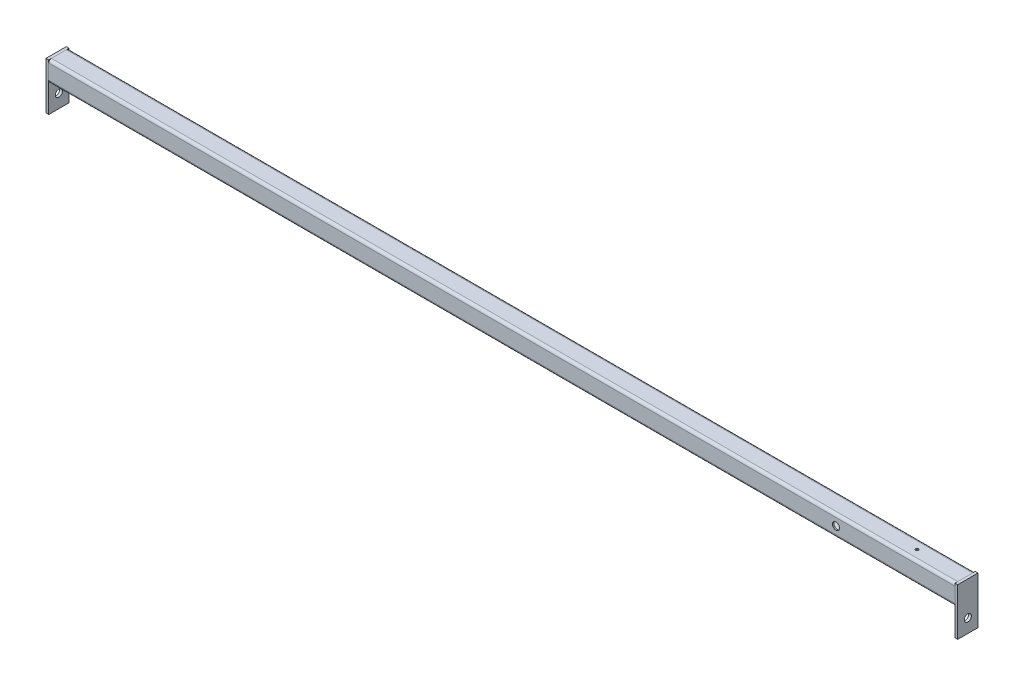
ISO-10303-21;
HEADER;
FILE_DESCRIPTION(('STEP AP214'),'2;1');
FILE_NAME('part.step','',(''),(''),'','','');
FILE_SCHEMA(('AUTOMOTIVE_DESIGN { 1 0 10303 214 1 1 1 1 }'));
ENDSEC;
DATA;
#1=APPLICATION_CONTEXT('core data for automotive mechanical design processes');
#2=APPLICATION_PROTOCOL_DEFINITION('international standard','automotive_design',2000,#1);
#3=PRODUCT_CONTEXT('',#1,'mechanical');
#4=PRODUCT('Part','Part','',(#3));
#5=PRODUCT_RELATED_PRODUCT_CATEGORY('part','',(#4));
#6=PRODUCT_DEFINITION_FORMATION('','',#4);
#7=PRODUCT_DEFINITION_CONTEXT('part definition',#1,'design');
#8=PRODUCT_DEFINITION('design','',#6,#7);
#9=PRODUCT_DEFINITION_SHAPE('','',#8);
#10=(LENGTH_UNIT() NAMED_UNIT(*) SI_UNIT(.MILLI.,.METRE.));
#11=(NAMED_UNIT(*) PLANE_ANGLE_UNIT() SI_UNIT($,.RADIAN.));
#12=(NAMED_UNIT(*) SI_UNIT($,.STERADIAN.) SOLID_ANGLE_UNIT());
#13=UNCERTAINTY_MEASURE_WITH_UNIT(LENGTH_MEASURE(1.E-05),#10,'distance_accuracy_value','');
#14=(GEOMETRIC_REPRESENTATION_CONTEXT(3) GLOBAL_UNCERTAINTY_ASSIGNED_CONTEXT((#13)) GLOBAL_UNIT_ASSIGNED_CONTEXT((#10,
#11,#12)) REPRESENTATION_CONTEXT('',''));
#15=CARTESIAN_POINT('',(0.,0.,0.));
#16=DIRECTION('',(0.,0.,1.));
#17=DIRECTION('',(1.,0.,0.));
#18=AXIS2_PLACEMENT_3D('',#15,#16,#17);
#19=CARTESIAN_POINT('',(1344.,66.,11.0000000000001));
#20=DIRECTION('',(-1.,0.,0.));
#21=DIRECTION('',(0.,0.,1.));
#22=AXIS2_PLACEMENT_3D('',#19,#20,#21);
#23=CYLINDRICAL_SURFACE('',#22,2.);
#24=CARTESIAN_POINT('',(2.,66.,11.));
#25=DIRECTION('',(1.,0.,0.));
#26=DIRECTION('',(0.,0.,-1.));
#27=AXIS2_PLACEMENT_3D('',#24,#25,#26);
#28=CIRCLE('',#27,2.);
#29=CARTESIAN_POINT('',(2.00000000000045,68.,11.));
#30=VERTEX_POINT('',#29);
#31=CARTESIAN_POINT('',(2.,66.,13.));
#32=VERTEX_POINT('',#31);
#33=EDGE_CURVE('E14',#30,#32,#28,.T.);
#34=ORIENTED_EDGE('',*,*,#33,.F.);
#35=DIRECTION('',(-1.,0.,0.));
#36=VECTOR('',#35,1.);
#37=CARTESIAN_POINT('',(1344.,68.,11.0000000000001));
#38=LINE('',#37,#36);
#39=CARTESIAN_POINT('',(1342.,68.,11.0000000000005));
#40=VERTEX_POINT('',#39);
#41=EDGE_CURVE('E235',#40,#30,#38,.T.);
#42=ORIENTED_EDGE('',*,*,#41,.F.);
#43=CARTESIAN_POINT('',(1342.,66.,11.0000000000001));
#44=DIRECTION('',(-1.,0.,0.));
#45=DIRECTION('',(0.,0.,1.));
#46=AXIS2_PLACEMENT_3D('',#43,#44,#45);
#47=CIRCLE('',#46,2.);
#48=CARTESIAN_POINT('',(1342.,66.,13.0000000000001));
#49=VERTEX_POINT('',#48);
#50=EDGE_CURVE('E216',#49,#40,#47,.T.);
#51=ORIENTED_EDGE('',*,*,#50,.F.);
#52=DIRECTION('',(-1.,0.,0.));
#53=VECTOR('',#52,1.);
#54=CARTESIAN_POINT('',(1344.,66.,13.0000000000001));
#55=LINE('',#54,#53);
#56=EDGE_CURVE('E256',#49,#32,#55,.T.);
#57=ORIENTED_EDGE('',*,*,#56,.T.);
#58=EDGE_LOOP('',(#34,#42,#51,#57));
#59=FACE_BOUND('',#58,.T.);
#60=ADVANCED_FACE('F88',(#59),#23,.F.);
#61=CARTESIAN_POINT('',(1344.,68.,-10.9999999999999));
#62=DIRECTION('',(0.,-1.,0.));
#63=DIRECTION('',(0.,0.,-1.));
#64=AXIS2_PLACEMENT_3D('',#61,#62,#63);
#65=PLANE('',#64);
#66=CARTESIAN_POINT('',(1271.,68.,0.));
#67=DIRECTION('',(0.,-1.,0.));
#68=DIRECTION('',(0.,0.,-1.));
#69=AXIS2_PLACEMENT_3D('',#66,#67,#68);
#70=CIRCLE('',#69,2.09999999999999);
#71=CARTESIAN_POINT('',(1271.,68.,-2.09999999999999));
#72=VERTEX_POINT('',#71);
#73=EDGE_CURVE('E338',#72,#72,#70,.T.);
#74=ORIENTED_EDGE('',*,*,#73,.F.);
#75=EDGE_LOOP('',(#74));
#76=FACE_BOUND('',#75,.T.);
#77=DIRECTION('',(0.,0.,1.));
#78=VECTOR('',#77,1.);
#79=CARTESIAN_POINT('',(2.,68.,-10.9999999999999));
#80=LINE('',#79,#78);
#81=CARTESIAN_POINT('',(2.,68.,-11.0000000000024));
#82=VERTEX_POINT('',#81);
#83=EDGE_CURVE('E311',#82,#30,#80,.T.);
#84=ORIENTED_EDGE('',*,*,#83,.F.);
#85=DIRECTION('',(-1.,0.,0.));
#86=VECTOR('',#85,1.);
#87=CARTESIAN_POINT('',(1344.,68.,-10.9999999999999));
#88=LINE('',#87,#86);
#89=CARTESIAN_POINT('',(1342.,68.,-11.0000000000009));
#90=VERTEX_POINT('',#89);
#91=EDGE_CURVE('E238',#90,#82,#88,.T.);
#92=ORIENTED_EDGE('',*,*,#91,.F.);
#93=DIRECTION('',(0.,0.,-1.));
#94=VECTOR('',#93,1.);
#95=CARTESIAN_POINT('',(1342.,68.,-10.9999999999999));
#96=LINE('',#95,#94);
#97=EDGE_CURVE('E273',#40,#90,#96,.T.);
#98=ORIENTED_EDGE('',*,*,#97,.F.);
#99=ORIENTED_EDGE('',*,*,#41,.T.);
#100=EDGE_LOOP('',(#84,#92,#98,#99));
#101=FACE_BOUND('',#100,.T.);
#102=ADVANCED_FACE('F386',(#76,#101),#65,.T.);
#103=CARTESIAN_POINT('',(1344.,66.,-10.9999999999999));
#104=DIRECTION('',(-1.,0.,0.));
#105=DIRECTION('',(0.,0.,1.));
#106=AXIS2_PLACEMENT_3D('',#103,#104,#105);
#107=CYLINDRICAL_SURFACE('',#106,2.);
#108=CARTESIAN_POINT('',(2.,66.,-11.));
#109=DIRECTION('',(1.,0.,0.));
#110=DIRECTION('',(0.,0.,-1.));
#111=AXIS2_PLACEMENT_3D('',#108,#109,#110);
#112=CIRCLE('',#111,2.);
#113=CARTESIAN_POINT('',(2.,66.,-13.));
#114=VERTEX_POINT('',#113);
#115=EDGE_CURVE('E135',#114,#82,#112,.T.);
#116=ORIENTED_EDGE('',*,*,#115,.F.);
#117=DIRECTION('',(-1.,0.,0.));
#118=VECTOR('',#117,1.);
#119=CARTESIAN_POINT('',(1344.,66.,-12.9999999999999));
#120=LINE('',#119,#118);
#121=CARTESIAN_POINT('',(1342.,66.,-12.9999999999999));
#122=VERTEX_POINT('',#121);
#123=EDGE_CURVE('E241',#122,#114,#120,.T.);
#124=ORIENTED_EDGE('',*,*,#123,.F.);
#125=CARTESIAN_POINT('',(1342.,66.,-10.9999999999999));
#126=DIRECTION('',(-1.,0.,0.));
#127=DIRECTION('',(0.,0.,1.));
#128=AXIS2_PLACEMENT_3D('',#125,#126,#127);
#129=CIRCLE('',#128,2.);
#130=EDGE_CURVE('E275',#90,#122,#129,.T.);
#131=ORIENTED_EDGE('',*,*,#130,.F.);
#132=ORIENTED_EDGE('',*,*,#91,.T.);
#133=EDGE_LOOP('',(#116,#124,#131,#132));
#134=FACE_BOUND('',#133,.T.);
#135=ADVANCED_FACE('F391',(#134),#107,.F.);
#136=CARTESIAN_POINT('',(1344.,66.,-12.9999999999999));
#137=DIRECTION('',(0.,0.,1.));
#138=DIRECTION('',(1.,0.,0.));
#139=AXIS2_PLACEMENT_3D('',#136,#137,#138);
#140=PLANE('',#139);
#141=CARTESIAN_POINT('',(1166.,55.,-12.9999999999999));
#142=DIRECTION('',(0.,0.,1.));
#143=DIRECTION('',(1.,0.,0.));
#144=AXIS2_PLACEMENT_3D('',#141,#142,#143);
#145=CIRCLE('',#144,5.24999999999998);
#146=CARTESIAN_POINT('',(1171.25,55.,-12.9999999999999));
#147=VERTEX_POINT('',#146);
#148=EDGE_CURVE('E329',#147,#147,#145,.T.);
#149=ORIENTED_EDGE('',*,*,#148,.F.);
#150=EDGE_LOOP('',(#149));
#151=FACE_BOUND('',#150,.T.);
#152=DIRECTION('',(0.,1.,0.));
#153=VECTOR('',#152,1.);
#154=CARTESIAN_POINT('',(2.,66.,-13.));
#155=LINE('',#154,#153);
#156=CARTESIAN_POINT('',(2.,44.,-13.));
#157=VERTEX_POINT('',#156);
#158=EDGE_CURVE('E308',#157,#114,#155,.T.);
#159=ORIENTED_EDGE('',*,*,#158,.F.);
#160=DIRECTION('',(-1.,0.,0.));
#161=VECTOR('',#160,1.);
#162=CARTESIAN_POINT('',(1344.,44.,-12.9999999999999));
#163=LINE('',#162,#161);
#164=CARTESIAN_POINT('',(1342.,44.,-12.9999999999999));
#165=VERTEX_POINT('',#164);
#166=EDGE_CURVE('E244',#165,#157,#163,.T.);
#167=ORIENTED_EDGE('',*,*,#166,.F.);
#168=DIRECTION('',(0.,-1.,0.));
#169=VECTOR('',#168,1.);
#170=CARTESIAN_POINT('',(1342.,66.,-12.9999999999999));
#171=LINE('',#170,#169);
#172=EDGE_CURVE('E277',#122,#165,#171,.T.);
#173=ORIENTED_EDGE('',*,*,#172,.F.);
#174=ORIENTED_EDGE('',*,*,#123,.T.);
#175=EDGE_LOOP('',(#159,#167,#173,#174));
#176=FACE_BOUND('',#175,.T.);
#177=ADVANCED_FACE('F418',(#151,#176),#140,.T.);
#178=CARTESIAN_POINT('',(1344.,44.,-10.9999999999999));
#179=DIRECTION('',(-1.,0.,0.));
#180=DIRECTION('',(0.,0.,1.));
#181=AXIS2_PLACEMENT_3D('',#178,#179,#180);
#182=CYLINDRICAL_SURFACE('',#181,2.);
#183=CARTESIAN_POINT('',(2.,44.,-11.));
#184=DIRECTION('',(1.,0.,0.));
#185=DIRECTION('',(0.,0.,-1.));
#186=AXIS2_PLACEMENT_3D('',#183,#184,#185);
#187=CIRCLE('',#186,2.);
#188=CARTESIAN_POINT('',(2.,42.,-11.0000000000011));
#189=VERTEX_POINT('',#188);
#190=EDGE_CURVE('E306',#189,#157,#187,.T.);
#191=ORIENTED_EDGE('',*,*,#190,.F.);
#192=DIRECTION('',(-1.,0.,0.));
#193=VECTOR('',#192,1.);
#194=CARTESIAN_POINT('',(1344.,42.,-10.9999999999999));
#195=LINE('',#194,#193);
#196=CARTESIAN_POINT('',(1342.,42.,-11.0000000000024));
#197=VERTEX_POINT('',#196);
#198=EDGE_CURVE('E247',#197,#189,#195,.T.);
#199=ORIENTED_EDGE('',*,*,#198,.F.);
#200=CARTESIAN_POINT('',(1342.,44.,-10.9999999999999));
#201=DIRECTION('',(-1.,0.,0.));
#202=DIRECTION('',(0.,0.,1.));
#203=AXIS2_PLACEMENT_3D('',#200,#201,#202);
#204=CIRCLE('',#203,2.);
#205=EDGE_CURVE('E279',#165,#197,#204,.T.);
#206=ORIENTED_EDGE('',*,*,#205,.F.);
#207=ORIENTED_EDGE('',*,*,#166,.T.);
#208=EDGE_LOOP('',(#191,#199,#206,#207));
#209=FACE_BOUND('',#208,.T.);
#210=ADVANCED_FACE('F414',(#209),#182,.F.);
#211=CARTESIAN_POINT('',(1344.,42.,11.0000000000001));
#212=DIRECTION('',(0.,1.,0.));
#213=DIRECTION('',(0.,0.,1.));
#214=AXIS2_PLACEMENT_3D('',#211,#212,#213);
#215=PLANE('',#214);
#216=CARTESIAN_POINT('',(1271.,42.,0.));
#217=DIRECTION('',(0.,1.,0.));
#218=DIRECTION('',(0.,0.,1.));
#219=AXIS2_PLACEMENT_3D('',#216,#217,#218);
#220=CIRCLE('',#219,2.09999999999999);
#221=CARTESIAN_POINT('',(1271.,42.,2.09999999999999));
#222=VERTEX_POINT('',#221);
#223=EDGE_CURVE('E341',#222,#222,#220,.T.);
#224=ORIENTED_EDGE('',*,*,#223,.F.);
#225=EDGE_LOOP('',(#224));
#226=FACE_BOUND('',#225,.T.);
#227=DIRECTION('',(0.,0.,-1.));
#228=VECTOR('',#227,1.);
#229=CARTESIAN_POINT('',(2.,42.,11.0000000000001));
#230=LINE('',#229,#228);
#231=CARTESIAN_POINT('',(2.,42.,11.0000000000001));
#232=VERTEX_POINT('',#231);
#233=EDGE_CURVE('E304',#232,#189,#230,.T.);
#234=ORIENTED_EDGE('',*,*,#233,.F.);
#235=DIRECTION('',(-1.,0.,0.));
#236=VECTOR('',#235,1.);
#237=CARTESIAN_POINT('',(1344.,42.,11.0000000000001));
#238=LINE('',#237,#236);
#239=CARTESIAN_POINT('',(1342.,42.,10.9999999999991));
#240=VERTEX_POINT('',#239);
#241=EDGE_CURVE('E250',#240,#232,#238,.T.);
#242=ORIENTED_EDGE('',*,*,#241,.F.);
#243=DIRECTION('',(0.,0.,1.));
#244=VECTOR('',#243,1.);
#245=CARTESIAN_POINT('',(1342.,42.,11.0000000000001));
#246=LINE('',#245,#244);
#247=EDGE_CURVE('E229',#197,#240,#246,.T.);
#248=ORIENTED_EDGE('',*,*,#247,.F.);
#249=ORIENTED_EDGE('',*,*,#198,.T.);
#250=EDGE_LOOP('',(#234,#242,#248,#249));
#251=FACE_BOUND('',#250,.T.);
#252=ADVANCED_FACE('F409',(#226,#251),#215,.T.);
#253=CARTESIAN_POINT('',(1344.,44.,11.0000000000001));
#254=DIRECTION('',(-1.,0.,0.));
#255=DIRECTION('',(0.,0.,1.));
#256=AXIS2_PLACEMENT_3D('',#253,#254,#255);
#257=CYLINDRICAL_SURFACE('',#256,2.);
#258=CARTESIAN_POINT('',(2.,44.,11.));
#259=DIRECTION('',(1.,0.,0.));
#260=DIRECTION('',(0.,0.,-1.));
#261=AXIS2_PLACEMENT_3D('',#258,#259,#260);
#262=CIRCLE('',#261,2.);
#263=CARTESIAN_POINT('',(2.,44.,13.));
#264=VERTEX_POINT('',#263);
#265=EDGE_CURVE('E302',#264,#232,#262,.T.);
#266=ORIENTED_EDGE('',*,*,#265,.F.);
#267=DIRECTION('',(-1.,0.,0.));
#268=VECTOR('',#267,1.);
#269=CARTESIAN_POINT('',(1344.,44.,13.0000000000001));
#270=LINE('',#269,#268);
#271=CARTESIAN_POINT('',(1342.,44.,13.0000000000001));
#272=VERTEX_POINT('',#271);
#273=EDGE_CURVE('E253',#272,#264,#270,.T.);
#274=ORIENTED_EDGE('',*,*,#273,.F.);
#275=CARTESIAN_POINT('',(1342.,44.,11.0000000000001));
#276=DIRECTION('',(-1.,0.,0.));
#277=DIRECTION('',(0.,0.,1.));
#278=AXIS2_PLACEMENT_3D('',#275,#276,#277);
#279=CIRCLE('',#278,2.);
#280=EDGE_CURVE('E227',#240,#272,#279,.T.);
#281=ORIENTED_EDGE('',*,*,#280,.F.);
#282=ORIENTED_EDGE('',*,*,#241,.T.);
#283=EDGE_LOOP('',(#266,#274,#281,#282));
#284=FACE_BOUND('',#283,.T.);
#285=ADVANCED_FACE('F404',(#284),#257,.F.);
#286=CARTESIAN_POINT('',(1344.,44.,13.0000000000001));
#287=DIRECTION('',(0.,0.,-1.));
#288=DIRECTION('',(-1.,0.,0.));
#289=AXIS2_PLACEMENT_3D('',#286,#287,#288);
#290=PLANE('',#289);
#291=CARTESIAN_POINT('',(1166.,55.,13.0000000000001));
#292=DIRECTION('',(0.,0.,-1.));
#293=DIRECTION('',(-1.,0.,0.));
#294=AXIS2_PLACEMENT_3D('',#291,#292,#293);
#295=CIRCLE('',#294,5.24999999999998);
#296=CARTESIAN_POINT('',(1160.75,55.,13.0000000000001));
#297=VERTEX_POINT('',#296);
#298=EDGE_CURVE('E258',#297,#297,#295,.T.);
#299=ORIENTED_EDGE('',*,*,#298,.F.);
#300=EDGE_LOOP('',(#299));
#301=FACE_BOUND('',#300,.T.);
#302=DIRECTION('',(0.,-1.,0.));
#303=VECTOR('',#302,1.);
#304=CARTESIAN_POINT('',(2.,44.,13.));
#305=LINE('',#304,#303);
#306=EDGE_CURVE('E299',#32,#264,#305,.T.);
#307=ORIENTED_EDGE('',*,*,#306,.F.);
#308=ORIENTED_EDGE('',*,*,#56,.F.);
#309=DIRECTION('',(0.,1.,0.));
#310=VECTOR('',#309,1.);
#311=CARTESIAN_POINT('',(1342.,44.,13.0000000000001));
#312=LINE('',#311,#310);
#313=EDGE_CURVE('E282',#272,#49,#312,.T.);
#314=ORIENTED_EDGE('',*,*,#313,.F.);
#315=ORIENTED_EDGE('',*,*,#273,.T.);
#316=EDGE_LOOP('',(#307,#308,#314,#315));
#317=FACE_BOUND('',#316,.T.);
#318=ADVANCED_FACE('F381',(#301,#317),#290,.T.);
#319=CARTESIAN_POINT('',(1342.,35.,0.));
#320=DIRECTION('',(-1.,0.,0.));
#321=DIRECTION('',(0.,0.,1.));
#322=AXIS2_PLACEMENT_3D('',#319,#320,#321);
#323=PLANE('',#322);
#324=ORIENTED_EDGE('',*,*,#50,.T.);
#325=ORIENTED_EDGE('',*,*,#97,.T.);
#326=ORIENTED_EDGE('',*,*,#130,.T.);
#327=ORIENTED_EDGE('',*,*,#172,.T.);
#328=ORIENTED_EDGE('',*,*,#205,.T.);
#329=ORIENTED_EDGE('',*,*,#247,.T.);
#330=ORIENTED_EDGE('',*,*,#280,.T.);
#331=ORIENTED_EDGE('',*,*,#313,.T.);
#332=EDGE_LOOP('',(#324,#325,#326,#327,#328,#329,#330,#331));
#333=FACE_BOUND('',#332,.T.);
#334=DIRECTION('',(0.,0.,-1.));
#335=VECTOR('',#334,1.);
#336=CARTESIAN_POINT('',(1342.,70.,-10.9999999999999));
#337=LINE('',#336,#335);
#338=CARTESIAN_POINT('',(1342.,70.,10.9999999999991));
#339=VERTEX_POINT('',#338);
#340=CARTESIAN_POINT('',(1342.,70.,-11.0000000000024));
#341=VERTEX_POINT('',#340);
#342=EDGE_CURVE('E286',#339,#341,#337,.T.);
#343=ORIENTED_EDGE('',*,*,#342,.F.);
#344=CARTESIAN_POINT('',(1342.,66.,11.0000000000001));
#345=DIRECTION('',(-1.,0.,0.));
#346=DIRECTION('',(0.,0.,1.));
#347=AXIS2_PLACEMENT_3D('',#344,#345,#346);
#348=CIRCLE('',#347,4.);
#349=CARTESIAN_POINT('',(1342.,66.,15.0000000000001));
#350=VERTEX_POINT('',#349);
#351=EDGE_CURVE('E289',#350,#339,#348,.T.);
#352=ORIENTED_EDGE('',*,*,#351,.F.);
#353=DIRECTION('',(0.,1.,0.));
#354=VECTOR('',#353,1.);
#355=CARTESIAN_POINT('',(1342.,44.,15.0000000000001));
#356=LINE('',#355,#354);
#357=CARTESIAN_POINT('',(1342.,44.,15.0000000000001));
#358=VERTEX_POINT('',#357);
#359=EDGE_CURVE('E292',#358,#350,#356,.T.);
#360=ORIENTED_EDGE('',*,*,#359,.F.);
#361=CARTESIAN_POINT('',(1342.,44.,11.0000000000001));
#362=DIRECTION('',(-1.,0.,0.));
#363=DIRECTION('',(0.,0.,1.));
#364=AXIS2_PLACEMENT_3D('',#361,#362,#363);
#365=CIRCLE('',#364,4.);
#366=CARTESIAN_POINT('',(1342.,40.,11.0000000000005));
#367=VERTEX_POINT('',#366);
#368=EDGE_CURVE('E295',#367,#358,#365,.T.);
#369=ORIENTED_EDGE('',*,*,#368,.F.);
#370=DIRECTION('',(0.,0.,1.));
#371=VECTOR('',#370,1.);
#372=CARTESIAN_POINT('',(1342.,40.,11.0000000000001));
#373=LINE('',#372,#371);
#374=CARTESIAN_POINT('',(1342.,40.,-11.0000000000009));
#375=VERTEX_POINT('',#374);
#376=EDGE_CURVE('E213',#375,#367,#373,.T.);
#377=ORIENTED_EDGE('',*,*,#376,.F.);
#378=CARTESIAN_POINT('',(1342.,44.,-10.9999999999999));
#379=DIRECTION('',(-1.,0.,0.));
#380=DIRECTION('',(0.,0.,1.));
#381=AXIS2_PLACEMENT_3D('',#378,#379,#380);
#382=CIRCLE('',#381,4.);
#383=CARTESIAN_POINT('',(1342.,44.,-14.9999999999999));
#384=VERTEX_POINT('',#383);
#385=EDGE_CURVE('E206',#384,#375,#382,.T.);
#386=ORIENTED_EDGE('',*,*,#385,.F.);
#387=DIRECTION('',(0.,-1.,0.));
#388=VECTOR('',#387,1.);
#389=CARTESIAN_POINT('',(1342.,66.,-14.9999999999999));
#390=LINE('',#389,#388);
#391=CARTESIAN_POINT('',(1342.,66.,-14.9999999999999));
#392=VERTEX_POINT('',#391);
#393=EDGE_CURVE('E210',#392,#384,#390,.T.);
#394=ORIENTED_EDGE('',*,*,#393,.F.);
#395=CARTESIAN_POINT('',(1342.,66.,-10.9999999999999));
#396=DIRECTION('',(-1.,0.,0.));
#397=DIRECTION('',(0.,0.,1.));
#398=AXIS2_PLACEMENT_3D('',#395,#396,#397);
#399=CIRCLE('',#398,4.);
#400=EDGE_CURVE('E284',#341,#392,#399,.T.);
#401=ORIENTED_EDGE('',*,*,#400,.F.);
#402=EDGE_LOOP('',(#343,#352,#360,#369,#377,#386,#394,#401));
#403=FACE_BOUND('',#402,.T.);
#404=ADVANCED_FACE('F208',(#333,#403),#323,.F.);
#405=CARTESIAN_POINT('',(1344.,66.,-10.9999999999999));
#406=DIRECTION('',(-1.,0.,0.));
#407=DIRECTION('',(0.,0.,1.));
#408=AXIS2_PLACEMENT_3D('',#405,#406,#407);
#409=CYLINDRICAL_SURFACE('',#408,4.);
#410=DIRECTION('',(-1.,0.,0.));
#411=VECTOR('',#410,1.);
#412=CARTESIAN_POINT('',(1344.,66.,-14.9999999999999));
#413=LINE('',#412,#411);
#414=CARTESIAN_POINT('',(2.,66.,-15.));
#415=VERTEX_POINT('',#414);
#416=EDGE_CURVE('E222',#392,#415,#413,.T.);
#417=ORIENTED_EDGE('',*,*,#416,.T.);
#418=CARTESIAN_POINT('',(2.,66.,-11.));
#419=DIRECTION('',(1.,0.,0.));
#420=DIRECTION('',(0.,0.,-1.));
#421=AXIS2_PLACEMENT_3D('',#418,#419,#420);
#422=CIRCLE('',#421,4.);
#423=CARTESIAN_POINT('',(2.00000000000045,70.,-11.));
#424=VERTEX_POINT('',#423);
#425=EDGE_CURVE('E91',#415,#424,#422,.T.);
#426=ORIENTED_EDGE('',*,*,#425,.T.);
#427=DIRECTION('',(-1.,0.,0.));
#428=VECTOR('',#427,1.);
#429=CARTESIAN_POINT('',(1344.,70.,-10.9999999999999));
#430=LINE('',#429,#428);
#431=EDGE_CURVE('E228',#341,#424,#430,.T.);
#432=ORIENTED_EDGE('',*,*,#431,.F.);
#433=ORIENTED_EDGE('',*,*,#400,.T.);
#434=EDGE_LOOP('',(#417,#426,#432,#433));
#435=FACE_BOUND('',#434,.T.);
#436=ADVANCED_FACE('F372',(#435),#409,.T.);
#437=CARTESIAN_POINT('',(1344.,70.,-10.9999999999999));
#438=DIRECTION('',(0.,-1.,0.));
#439=DIRECTION('',(0.,0.,-1.));
#440=AXIS2_PLACEMENT_3D('',#437,#438,#439);
#441=PLANE('',#440);
#442=CARTESIAN_POINT('',(1271.,70.,0.));
#443=DIRECTION('',(0.,-1.,0.));
#444=DIRECTION('',(0.,0.,-1.));
#445=AXIS2_PLACEMENT_3D('',#442,#443,#444);
#446=CIRCLE('',#445,2.09999999999999);
#447=CARTESIAN_POINT('',(1271.,70.,-2.09999999999999));
#448=VERTEX_POINT('',#447);
#449=EDGE_CURVE('E344',#448,#448,#446,.T.);
#450=ORIENTED_EDGE('',*,*,#449,.T.);
#451=EDGE_LOOP('',(#450));
#452=FACE_BOUND('',#451,.T.);
#453=ORIENTED_EDGE('',*,*,#431,.T.);
#454=DIRECTION('',(0.,0.,1.));
#455=VECTOR('',#454,1.);
#456=CARTESIAN_POINT('',(2.,70.,-10.9999999999999));
#457=LINE('',#456,#455);
#458=CARTESIAN_POINT('',(2.,70.,11.0000000000001));
#459=VERTEX_POINT('',#458);
#460=EDGE_CURVE('E301',#424,#459,#457,.T.);
#461=ORIENTED_EDGE('',*,*,#460,.T.);
#462=DIRECTION('',(-1.,0.,0.));
#463=VECTOR('',#462,1.);
#464=CARTESIAN_POINT('',(1344.,70.,11.0000000000001));
#465=LINE('',#464,#463);
#466=EDGE_CURVE('E232',#339,#459,#465,.T.);
#467=ORIENTED_EDGE('',*,*,#466,.F.);
#468=ORIENTED_EDGE('',*,*,#342,.T.);
#469=EDGE_LOOP('',(#453,#461,#467,#468));
#470=FACE_BOUND('',#469,.T.);
#471=ADVANCED_FACE('F369',(#452,#470),#441,.F.);
#472=CARTESIAN_POINT('',(1344.,66.,11.0000000000001));
#473=DIRECTION('',(-1.,0.,0.));
#474=DIRECTION('',(0.,0.,1.));
#475=AXIS2_PLACEMENT_3D('',#472,#473,#474);
#476=CYLINDRICAL_SURFACE('',#475,4.);
#477=ORIENTED_EDGE('',*,*,#466,.T.);
#478=CARTESIAN_POINT('',(2.,66.,11.));
#479=DIRECTION('',(1.,0.,0.));
#480=DIRECTION('',(0.,0.,-1.));
#481=AXIS2_PLACEMENT_3D('',#478,#479,#480);
#482=CIRCLE('',#481,4.);
#483=CARTESIAN_POINT('',(2.,66.,15.));
#484=VERTEX_POINT('',#483);
#485=EDGE_CURVE('E122',#459,#484,#482,.T.);
#486=ORIENTED_EDGE('',*,*,#485,.T.);
#487=DIRECTION('',(-1.,0.,0.));
#488=VECTOR('',#487,1.);
#489=CARTESIAN_POINT('',(1344.,66.,15.0000000000001));
#490=LINE('',#489,#488);
#491=EDGE_CURVE('E261',#350,#484,#490,.T.);
#492=ORIENTED_EDGE('',*,*,#491,.F.);
#493=ORIENTED_EDGE('',*,*,#351,.T.);
#494=EDGE_LOOP('',(#477,#486,#492,#493));
#495=FACE_BOUND('',#494,.T.);
#496=ADVANCED_FACE('F366',(#495),#476,.T.);
#497=CARTESIAN_POINT('',(1344.,44.,15.0000000000001));
#498=DIRECTION('',(0.,0.,-1.));
#499=DIRECTION('',(-1.,0.,0.));
#500=AXIS2_PLACEMENT_3D('',#497,#498,#499);
#501=PLANE('',#500);
#502=CARTESIAN_POINT('',(1166.,55.,15.));
#503=DIRECTION('',(0.,0.,1.));
#504=DIRECTION('',(1.,0.,0.));
#505=AXIS2_PLACEMENT_3D('',#502,#503,#504);
#506=CIRCLE('',#505,5.24999999999998);
#507=CARTESIAN_POINT('',(1171.25,55.,15.));
#508=VERTEX_POINT('',#507);
#509=EDGE_CURVE('E335',#508,#508,#506,.T.);
#510=ORIENTED_EDGE('',*,*,#509,.F.);
#511=EDGE_LOOP('',(#510));
#512=FACE_BOUND('',#511,.T.);
#513=ORIENTED_EDGE('',*,*,#491,.T.);
#514=DIRECTION('',(0.,-1.,0.));
#515=VECTOR('',#514,1.);
#516=CARTESIAN_POINT('',(2.,44.,15.));
#517=LINE('',#516,#515);
#518=CARTESIAN_POINT('',(2.,44.,15.));
#519=VERTEX_POINT('',#518);
#520=EDGE_CURVE('E321',#484,#519,#517,.T.);
#521=ORIENTED_EDGE('',*,*,#520,.T.);
#522=DIRECTION('',(-1.,0.,0.));
#523=VECTOR('',#522,1.);
#524=CARTESIAN_POINT('',(1344.,44.,15.0000000000001));
#525=LINE('',#524,#523);
#526=EDGE_CURVE('E264',#358,#519,#525,.T.);
#527=ORIENTED_EDGE('',*,*,#526,.F.);
#528=ORIENTED_EDGE('',*,*,#359,.T.);
#529=EDGE_LOOP('',(#513,#521,#527,#528));
#530=FACE_BOUND('',#529,.T.);
#531=ADVANCED_FACE('F364',(#512,#530),#501,.F.);
#532=CARTESIAN_POINT('',(1344.,44.,11.0000000000001));
#533=DIRECTION('',(-1.,0.,0.));
#534=DIRECTION('',(0.,0.,1.));
#535=AXIS2_PLACEMENT_3D('',#532,#533,#534);
#536=CYLINDRICAL_SURFACE('',#535,4.);
#537=ORIENTED_EDGE('',*,*,#526,.T.);
#538=CARTESIAN_POINT('',(2.,44.,11.));
#539=DIRECTION('',(1.,0.,0.));
#540=DIRECTION('',(0.,0.,-1.));
#541=AXIS2_PLACEMENT_3D('',#538,#539,#540);
#542=CIRCLE('',#541,4.);
#543=CARTESIAN_POINT('',(2.,40.,10.9999999999989));
#544=VERTEX_POINT('',#543);
#545=EDGE_CURVE('E318',#519,#544,#542,.T.);
#546=ORIENTED_EDGE('',*,*,#545,.T.);
#547=DIRECTION('',(-1.,0.,0.));
#548=VECTOR('',#547,1.);
#549=CARTESIAN_POINT('',(1344.,40.,11.0000000000001));
#550=LINE('',#549,#548);
#551=EDGE_CURVE('E267',#367,#544,#550,.T.);
#552=ORIENTED_EDGE('',*,*,#551,.F.);
#553=ORIENTED_EDGE('',*,*,#368,.T.);
#554=EDGE_LOOP('',(#537,#546,#552,#553));
#555=FACE_BOUND('',#554,.T.);
#556=ADVANCED_FACE('F356',(#555),#536,.T.);
#557=CARTESIAN_POINT('',(1344.,40.,11.0000000000001));
#558=DIRECTION('',(0.,1.,0.));
#559=DIRECTION('',(0.,0.,1.));
#560=AXIS2_PLACEMENT_3D('',#557,#558,#559);
#561=PLANE('',#560);
#562=CARTESIAN_POINT('',(1271.,40.,0.));
#563=DIRECTION('',(0.,-1.,0.));
#564=DIRECTION('',(0.,0.,-1.));
#565=AXIS2_PLACEMENT_3D('',#562,#563,#564);
#566=CIRCLE('',#565,2.09999999999999);
#567=CARTESIAN_POINT('',(1271.,40.,-2.09999999999999));
#568=VERTEX_POINT('',#567);
#569=EDGE_CURVE('E347',#568,#568,#566,.T.);
#570=ORIENTED_EDGE('',*,*,#569,.F.);
#571=EDGE_LOOP('',(#570));
#572=FACE_BOUND('',#571,.T.);
#573=ORIENTED_EDGE('',*,*,#551,.T.);
#574=DIRECTION('',(0.,0.,-1.));
#575=VECTOR('',#574,1.);
#576=CARTESIAN_POINT('',(2.,40.,11.0000000000001));
#577=LINE('',#576,#575);
#578=CARTESIAN_POINT('',(2.,40.,-11.0000000000024));
#579=VERTEX_POINT('',#578);
#580=EDGE_CURVE('E315',#544,#579,#577,.T.);
#581=ORIENTED_EDGE('',*,*,#580,.T.);
#582=DIRECTION('',(-1.,0.,0.));
#583=VECTOR('',#582,1.);
#584=CARTESIAN_POINT('',(1344.,40.,-10.9999999999999));
#585=LINE('',#584,#583);
#586=EDGE_CURVE('E221',#375,#579,#585,.T.);
#587=ORIENTED_EDGE('',*,*,#586,.F.);
#588=ORIENTED_EDGE('',*,*,#376,.T.);
#589=EDGE_LOOP('',(#573,#581,#587,#588));
#590=FACE_BOUND('',#589,.T.);
#591=ADVANCED_FACE('F353',(#572,#590),#561,.F.);
#592=CARTESIAN_POINT('',(1344.,44.,-10.9999999999999));
#593=DIRECTION('',(-1.,0.,0.));
#594=DIRECTION('',(0.,0.,1.));
#595=AXIS2_PLACEMENT_3D('',#592,#593,#594);
#596=CYLINDRICAL_SURFACE('',#595,4.);
#597=ORIENTED_EDGE('',*,*,#586,.T.);
#598=CARTESIAN_POINT('',(2.,44.,-11.));
#599=DIRECTION('',(1.,0.,0.));
#600=DIRECTION('',(0.,0.,-1.));
#601=AXIS2_PLACEMENT_3D('',#598,#599,#600);
#602=CIRCLE('',#601,4.);
#603=CARTESIAN_POINT('',(2.,44.,-15.));
#604=VERTEX_POINT('',#603);
#605=EDGE_CURVE('E106',#579,#604,#602,.T.);
#606=ORIENTED_EDGE('',*,*,#605,.T.);
#607=DIRECTION('',(-1.,0.,0.));
#608=VECTOR('',#607,1.);
#609=CARTESIAN_POINT('',(1344.,44.,-14.9999999999999));
#610=LINE('',#609,#608);
#611=EDGE_CURVE('E218',#384,#604,#610,.T.);
#612=ORIENTED_EDGE('',*,*,#611,.F.);
#613=ORIENTED_EDGE('',*,*,#385,.T.);
#614=EDGE_LOOP('',(#597,#606,#612,#613));
#615=FACE_BOUND('',#614,.T.);
#616=ADVANCED_FACE('F219',(#615),#596,.T.);
#617=CARTESIAN_POINT('',(1344.,66.,-14.9999999999999));
#618=DIRECTION('',(0.,0.,1.));
#619=DIRECTION('',(1.,0.,0.));
#620=AXIS2_PLACEMENT_3D('',#617,#618,#619);
#621=PLANE('',#620);
#622=CARTESIAN_POINT('',(1166.,55.,-15.));
#623=DIRECTION('',(0.,0.,1.));
#624=DIRECTION('',(1.,0.,0.));
#625=AXIS2_PLACEMENT_3D('',#622,#623,#624);
#626=CIRCLE('',#625,5.24999999999998);
#627=CARTESIAN_POINT('',(1171.25,55.,-15.));
#628=VERTEX_POINT('',#627);
#629=EDGE_CURVE('E332',#628,#628,#626,.T.);
#630=ORIENTED_EDGE('',*,*,#629,.T.);
#631=EDGE_LOOP('',(#630));
#632=FACE_BOUND('',#631,.T.);
#633=ORIENTED_EDGE('',*,*,#611,.T.);
#634=DIRECTION('',(0.,1.,0.));
#635=VECTOR('',#634,1.);
#636=CARTESIAN_POINT('',(2.,66.,-15.));
#637=LINE('',#636,#635);
#638=EDGE_CURVE('E97',#604,#415,#637,.T.);
#639=ORIENTED_EDGE('',*,*,#638,.T.);
#640=ORIENTED_EDGE('',*,*,#416,.F.);
#641=ORIENTED_EDGE('',*,*,#393,.T.);
#642=EDGE_LOOP('',(#633,#639,#640,#641));
#643=FACE_BOUND('',#642,.T.);
#644=ADVANCED_FACE('F225',(#632,#643),#621,.F.);
#645=CARTESIAN_POINT('',(2.,35.,0.));
#646=DIRECTION('',(1.,0.,0.));
#647=DIRECTION('',(0.,0.,-1.));
#648=AXIS2_PLACEMENT_3D('',#645,#646,#647);
#649=PLANE('',#648);
#650=ORIENTED_EDGE('',*,*,#306,.T.);
#651=ORIENTED_EDGE('',*,*,#265,.T.);
#652=ORIENTED_EDGE('',*,*,#233,.T.);
#653=ORIENTED_EDGE('',*,*,#190,.T.);
#654=ORIENTED_EDGE('',*,*,#158,.T.);
#655=ORIENTED_EDGE('',*,*,#115,.T.);
#656=ORIENTED_EDGE('',*,*,#83,.T.);
#657=ORIENTED_EDGE('',*,*,#33,.T.);
#658=EDGE_LOOP('',(#650,#651,#652,#653,#654,#655,#656,#657));
#659=FACE_BOUND('',#658,.T.);
#660=ORIENTED_EDGE('',*,*,#605,.F.);
#661=ORIENTED_EDGE('',*,*,#580,.F.);
#662=ORIENTED_EDGE('',*,*,#545,.F.);
#663=ORIENTED_EDGE('',*,*,#520,.F.);
#664=ORIENTED_EDGE('',*,*,#485,.F.);
#665=ORIENTED_EDGE('',*,*,#460,.F.);
#666=ORIENTED_EDGE('',*,*,#425,.F.);
#667=ORIENTED_EDGE('',*,*,#638,.F.);
#668=EDGE_LOOP('',(#660,#661,#662,#663,#664,#665,#666,#667));
#669=FACE_BOUND('',#668,.T.);
#670=ADVANCED_FACE('F361',(#659,#669),#649,.F.);
#671=CARTESIAN_POINT('',(1166.,55.,15.));
#672=DIRECTION('',(0.,0.,1.));
#673=DIRECTION('',(1.,0.,0.));
#674=AXIS2_PLACEMENT_3D('',#671,#672,#673);
#675=CYLINDRICAL_SURFACE('',#674,5.24999999999998);
#676=ORIENTED_EDGE('',*,*,#298,.T.);
#677=EDGE_LOOP('',(#676));
#678=FACE_BOUND('',#677,.T.);
#679=ORIENTED_EDGE('',*,*,#509,.T.);
#680=EDGE_LOOP('',(#679));
#681=FACE_BOUND('',#680,.T.);
#682=ADVANCED_FACE('F446',(#678,#681),#675,.F.);
#683=ORIENTED_EDGE('',*,*,#148,.T.);
#684=EDGE_LOOP('',(#683));
#685=FACE_BOUND('',#684,.T.);
#686=ORIENTED_EDGE('',*,*,#629,.F.);
#687=EDGE_LOOP('',(#686));
#688=FACE_BOUND('',#687,.T.);
#689=ADVANCED_FACE('F449',(#685,#688),#675,.F.);
#690=CARTESIAN_POINT('',(1271.,40.,0.));
#691=DIRECTION('',(0.,-1.,0.));
#692=DIRECTION('',(0.,0.,-1.));
#693=AXIS2_PLACEMENT_3D('',#690,#691,#692);
#694=CYLINDRICAL_SURFACE('',#693,2.09999999999999);
#695=ORIENTED_EDGE('',*,*,#223,.T.);
#696=EDGE_LOOP('',(#695));
#697=FACE_BOUND('',#696,.T.);
#698=ORIENTED_EDGE('',*,*,#569,.T.);
#699=EDGE_LOOP('',(#698));
#700=FACE_BOUND('',#699,.T.);
#701=ADVANCED_FACE('F351',(#697,#700),#694,.F.);
#702=ORIENTED_EDGE('',*,*,#73,.T.);
#703=EDGE_LOOP('',(#702));
#704=FACE_BOUND('',#703,.T.);
#705=ORIENTED_EDGE('',*,*,#449,.F.);
#706=EDGE_LOOP('',(#705));
#707=FACE_BOUND('',#706,.T.);
#708=ADVANCED_FACE('F472',(#704,#707),#694,.F.);
#709=CLOSED_SHELL('',(#60,#102,#135,#177,#210,#252,#285,#318,#404,#436,#471,#496,#531,#556,#591,
#616,#644,#670,#682,#689,#701,#708));
#710=MANIFOLD_SOLID_BREP('B2',#709);
#711=CARTESIAN_POINT('',(1342.,0.,15.0000000000001));
#712=DIRECTION('',(-1.,0.,0.));
#713=DIRECTION('',(0.,0.,1.));
#714=AXIS2_PLACEMENT_3D('',#711,#712,#713);
#715=PLANE('',#714);
#716=CARTESIAN_POINT('',(1342.,20.,0.));
#717=DIRECTION('',(-1.,0.,0.));
#718=DIRECTION('',(0.,0.,1.));
#719=AXIS2_PLACEMENT_3D('',#716,#717,#718);
#720=CIRCLE('',#719,5.24999999999983);
#721=CARTESIAN_POINT('',(1342.,20.,5.24999999999983));
#722=VERTEX_POINT('',#721);
#723=EDGE_CURVE('E722',#722,#722,#720,.T.);
#724=ORIENTED_EDGE('',*,*,#723,.F.);
#725=EDGE_LOOP('',(#724));
#726=FACE_BOUND('',#725,.T.);
#727=DIRECTION('',(0.,0.,1.));
#728=VECTOR('',#727,1.);
#729=CARTESIAN_POINT('',(1342.,70.,15.0000000000001));
#730=LINE('',#729,#728);
#731=CARTESIAN_POINT('',(1342.,70.,-14.9999999999999));
#732=VERTEX_POINT('',#731);
#733=CARTESIAN_POINT('',(1342.,70.,15.0000000000001));
#734=VERTEX_POINT('',#733);
#735=EDGE_CURVE('E718',#732,#734,#730,.T.);
#736=ORIENTED_EDGE('',*,*,#735,.F.);
#737=DIRECTION('',(0.,1.,0.));
#738=VECTOR('',#737,1.);
#739=CARTESIAN_POINT('',(1342.,0.,-14.9999999999999));
#740=LINE('',#739,#738);
#741=CARTESIAN_POINT('',(1342.,0.,-14.9999999999999));
#742=VERTEX_POINT('',#741);
#743=EDGE_CURVE('E86',#742,#732,#740,.T.);
#744=ORIENTED_EDGE('',*,*,#743,.F.);
#745=DIRECTION('',(0.,0.,1.));
#746=VECTOR('',#745,1.);
#747=CARTESIAN_POINT('',(1342.,0.,15.0000000000001));
#748=LINE('',#747,#746);
#749=CARTESIAN_POINT('',(1342.,0.,15.0000000000001));
#750=VERTEX_POINT('',#749);
#751=EDGE_CURVE('E711',#742,#750,#748,.T.);
#752=ORIENTED_EDGE('',*,*,#751,.T.);
#753=DIRECTION('',(0.,1.,0.));
#754=VECTOR('',#753,1.);
#755=CARTESIAN_POINT('',(1342.,0.,15.0000000000001));
#756=LINE('',#755,#754);
#757=EDGE_CURVE('E656',#750,#734,#756,.T.);
#758=ORIENTED_EDGE('',*,*,#757,.T.);
#759=EDGE_LOOP('',(#736,#744,#752,#758));
#760=FACE_BOUND('',#759,.T.);
#761=ADVANCED_FACE('F653',(#726,#760),#715,.T.);
#762=CARTESIAN_POINT('',(1346.,0.,-14.9999999999999));
#763=DIRECTION('',(0.,0.,-1.));
#764=DIRECTION('',(-1.,0.,0.));
#765=AXIS2_PLACEMENT_3D('',#762,#763,#764);
#766=PLANE('',#765);
#767=DIRECTION('',(-1.,0.,0.));
#768=VECTOR('',#767,1.);
#769=CARTESIAN_POINT('',(1346.,70.,-14.9999999999999));
#770=LINE('',#769,#768);
#771=CARTESIAN_POINT('',(1346.,70.,-14.9999999999999));
#772=VERTEX_POINT('',#771);
#773=EDGE_CURVE('E713',#772,#732,#770,.T.);
#774=ORIENTED_EDGE('',*,*,#773,.F.);
#775=DIRECTION('',(0.,1.,0.));
#776=VECTOR('',#775,1.);
#777=CARTESIAN_POINT('',(1346.,0.,-14.9999999999999));
#778=LINE('',#777,#776);
#779=CARTESIAN_POINT('',(1346.,0.,-14.9999999999999));
#780=VERTEX_POINT('',#779);
#781=EDGE_CURVE('E662',#780,#772,#778,.T.);
#782=ORIENTED_EDGE('',*,*,#781,.F.);
#783=DIRECTION('',(-1.,0.,0.));
#784=VECTOR('',#783,1.);
#785=CARTESIAN_POINT('',(1346.,0.,-14.9999999999999));
#786=LINE('',#785,#784);
#787=EDGE_CURVE('E708',#780,#742,#786,.T.);
#788=ORIENTED_EDGE('',*,*,#787,.T.);
#789=ORIENTED_EDGE('',*,*,#743,.T.);
#790=EDGE_LOOP('',(#774,#782,#788,#789));
#791=FACE_BOUND('',#790,.T.);
#792=ADVANCED_FACE('F729',(#791),#766,.T.);
#793=CARTESIAN_POINT('',(1346.,0.,15.0000000000001));
#794=DIRECTION('',(1.,0.,0.));
#795=DIRECTION('',(0.,0.,-1.));
#796=AXIS2_PLACEMENT_3D('',#793,#794,#795);
#797=PLANE('',#796);
#798=CARTESIAN_POINT('',(1346.,20.,0.));
#799=DIRECTION('',(1.,0.,0.));
#800=DIRECTION('',(0.,0.,-1.));
#801=AXIS2_PLACEMENT_3D('',#798,#799,#800);
#802=CIRCLE('',#801,5.24999999999999);
#803=CARTESIAN_POINT('',(1346.,20.,-5.24999999999999));
#804=VERTEX_POINT('',#803);
#805=EDGE_CURVE('E759',#804,#804,#802,.T.);
#806=ORIENTED_EDGE('',*,*,#805,.F.);
#807=EDGE_LOOP('',(#806));
#808=FACE_BOUND('',#807,.T.);
#809=DIRECTION('',(0.,0.,-1.));
#810=VECTOR('',#809,1.);
#811=CARTESIAN_POINT('',(1346.,70.,15.0000000000001));
#812=LINE('',#811,#810);
#813=CARTESIAN_POINT('',(1346.,70.,15.0000000000001));
#814=VERTEX_POINT('',#813);
#815=EDGE_CURVE('E703',#814,#772,#812,.T.);
#816=ORIENTED_EDGE('',*,*,#815,.F.);
#817=DIRECTION('',(0.,1.,0.));
#818=VECTOR('',#817,1.);
#819=CARTESIAN_POINT('',(1346.,0.,15.0000000000001));
#820=LINE('',#819,#818);
#821=CARTESIAN_POINT('',(1346.,0.,15.0000000000001));
#822=VERTEX_POINT('',#821);
#823=EDGE_CURVE('E698',#822,#814,#820,.T.);
#824=ORIENTED_EDGE('',*,*,#823,.F.);
#825=DIRECTION('',(0.,0.,-1.));
#826=VECTOR('',#825,1.);
#827=CARTESIAN_POINT('',(1346.,0.,15.0000000000001));
#828=LINE('',#827,#826);
#829=EDGE_CURVE('E701',#822,#780,#828,.T.);
#830=ORIENTED_EDGE('',*,*,#829,.T.);
#831=ORIENTED_EDGE('',*,*,#781,.T.);
#832=EDGE_LOOP('',(#816,#824,#830,#831));
#833=FACE_BOUND('',#832,.T.);
#834=ADVANCED_FACE('F700',(#808,#833),#797,.T.);
#835=CARTESIAN_POINT('',(1346.,0.,15.0000000000001));
#836=DIRECTION('',(0.,0.,1.));
#837=DIRECTION('',(0.,-1.,0.));
#838=AXIS2_PLACEMENT_3D('',#835,#836,#837);
#839=PLANE('',#838);
#840=DIRECTION('',(1.,0.,0.));
#841=VECTOR('',#840,1.);
#842=CARTESIAN_POINT('',(1346.,70.,15.0000000000001));
#843=LINE('',#842,#841);
#844=EDGE_CURVE('E721',#734,#814,#843,.T.);
#845=ORIENTED_EDGE('',*,*,#844,.F.);
#846=ORIENTED_EDGE('',*,*,#757,.F.);
#847=DIRECTION('',(1.,0.,0.));
#848=VECTOR('',#847,1.);
#849=CARTESIAN_POINT('',(1346.,0.,15.0000000000001));
#850=LINE('',#849,#848);
#851=EDGE_CURVE('E707',#750,#822,#850,.T.);
#852=ORIENTED_EDGE('',*,*,#851,.T.);
#853=ORIENTED_EDGE('',*,*,#823,.T.);
#854=EDGE_LOOP('',(#845,#846,#852,#853));
#855=FACE_BOUND('',#854,.T.);
#856=ADVANCED_FACE('F710',(#855),#839,.T.);
#857=CARTESIAN_POINT('',(1344.,0.,0.));
#858=DIRECTION('',(0.,1.,0.));
#859=DIRECTION('',(0.,0.,1.));
#860=AXIS2_PLACEMENT_3D('',#857,#858,#859);
#861=PLANE('',#860);
#862=ORIENTED_EDGE('',*,*,#751,.F.);
#863=ORIENTED_EDGE('',*,*,#787,.F.);
#864=ORIENTED_EDGE('',*,*,#829,.F.);
#865=ORIENTED_EDGE('',*,*,#851,.F.);
#866=EDGE_LOOP('',(#862,#863,#864,#865));
#867=FACE_BOUND('',#866,.T.);
#868=ADVANCED_FACE('F706',(#867),#861,.F.);
#869=CARTESIAN_POINT('',(1344.,70.,0.));
#870=DIRECTION('',(0.,1.,0.));
#871=DIRECTION('',(0.,0.,1.));
#872=AXIS2_PLACEMENT_3D('',#869,#870,#871);
#873=PLANE('',#872);
#874=ORIENTED_EDGE('',*,*,#735,.T.);
#875=ORIENTED_EDGE('',*,*,#844,.T.);
#876=ORIENTED_EDGE('',*,*,#815,.T.);
#877=ORIENTED_EDGE('',*,*,#773,.T.);
#878=EDGE_LOOP('',(#874,#875,#876,#877));
#879=FACE_BOUND('',#878,.T.);
#880=ADVANCED_FACE('F728',(#879),#873,.T.);
#881=CARTESIAN_POINT('',(1346.,20.,0.));
#882=DIRECTION('',(1.,0.,0.));
#883=DIRECTION('',(0.,0.,-1.));
#884=AXIS2_PLACEMENT_3D('',#881,#882,#883);
#885=CYLINDRICAL_SURFACE('',#884,5.24999999999983);
#886=ORIENTED_EDGE('',*,*,#723,.T.);
#887=EDGE_LOOP('',(#886));
#888=FACE_BOUND('',#887,.T.);
#889=ORIENTED_EDGE('',*,*,#805,.T.);
#890=EDGE_LOOP('',(#889));
#891=FACE_BOUND('',#890,.T.);
#892=ADVANCED_FACE('F748',(#888,#891),#885,.F.);
#893=CLOSED_SHELL('',(#761,#792,#834,#856,#868,#880,#892));
#894=MANIFOLD_SOLID_BREP('B8',#893);
#895=CARTESIAN_POINT('',(-2.,70.,15.));
#896=DIRECTION('',(1.,0.,0.));
#897=DIRECTION('',(0.,0.,-1.));
#898=AXIS2_PLACEMENT_3D('',#895,#896,#897);
#899=PLANE('',#898);
#900=CARTESIAN_POINT('',(-2.,20.,0.));
#901=DIRECTION('',(1.,0.,0.));
#902=DIRECTION('',(0.,0.,-1.));
#903=AXIS2_PLACEMENT_3D('',#900,#901,#902);
#904=CIRCLE('',#903,5.24999999999967);
#905=CARTESIAN_POINT('',(-2.,20.,-5.24999999999967));
#906=VERTEX_POINT('',#905);
#907=EDGE_CURVE('E875',#906,#906,#904,.T.);
#908=ORIENTED_EDGE('',*,*,#907,.T.);
#909=EDGE_LOOP('',(#908));
#910=FACE_BOUND('',#909,.T.);
#911=DIRECTION('',(0.,0.,1.));
#912=VECTOR('',#911,1.);
#913=CARTESIAN_POINT('',(-2.,0.,15.));
#914=LINE('',#913,#912);
#915=CARTESIAN_POINT('',(-2.,0.,-15.));
#916=VERTEX_POINT('',#915);
#917=CARTESIAN_POINT('',(-2.,0.,15.));
#918=VERTEX_POINT('',#917);
#919=EDGE_CURVE('E859',#916,#918,#914,.T.);
#920=ORIENTED_EDGE('',*,*,#919,.T.);
#921=DIRECTION('',(0.,-1.,0.));
#922=VECTOR('',#921,1.);
#923=CARTESIAN_POINT('',(-2.,70.,15.));
#924=LINE('',#923,#922);
#925=CARTESIAN_POINT('',(-2.,70.,15.));
#926=VERTEX_POINT('',#925);
#927=EDGE_CURVE('E651',#926,#918,#924,.T.);
#928=ORIENTED_EDGE('',*,*,#927,.F.);
#929=DIRECTION('',(0.,0.,1.));
#930=VECTOR('',#929,1.);
#931=CARTESIAN_POINT('',(-2.,70.,15.));
#932=LINE('',#931,#930);
#933=CARTESIAN_POINT('',(-2.,70.,-15.));
#934=VERTEX_POINT('',#933);
#935=EDGE_CURVE('E847',#934,#926,#932,.T.);
#936=ORIENTED_EDGE('',*,*,#935,.F.);
#937=DIRECTION('',(0.,-1.,0.));
#938=VECTOR('',#937,1.);
#939=CARTESIAN_POINT('',(-2.,70.,-15.));
#940=LINE('',#939,#938);
#941=EDGE_CURVE('E855',#934,#916,#940,.T.);
#942=ORIENTED_EDGE('',*,*,#941,.T.);
#943=EDGE_LOOP('',(#920,#928,#936,#942));
#944=FACE_BOUND('',#943,.T.);
#945=ADVANCED_FACE('F796',(#910,#944),#899,.F.);
#946=CARTESIAN_POINT('',(2.,70.,15.));
#947=DIRECTION('',(0.,0.,-1.));
#948=DIRECTION('',(-1.,0.,0.));
#949=AXIS2_PLACEMENT_3D('',#946,#947,#948);
#950=PLANE('',#949);
#951=DIRECTION('',(1.,0.,0.));
#952=VECTOR('',#951,1.);
#953=CARTESIAN_POINT('',(2.,0.,15.));
#954=LINE('',#953,#952);
#955=CARTESIAN_POINT('',(2.,0.,15.));
#956=VERTEX_POINT('',#955);
#957=EDGE_CURVE('E851',#918,#956,#954,.T.);
#958=ORIENTED_EDGE('',*,*,#957,.T.);
#959=DIRECTION('',(0.,-1.,0.));
#960=VECTOR('',#959,1.);
#961=CARTESIAN_POINT('',(2.,70.,15.));
#962=LINE('',#961,#960);
#963=CARTESIAN_POINT('',(2.,70.,15.));
#964=VERTEX_POINT('',#963);
#965=EDGE_CURVE('E804',#964,#956,#962,.T.);
#966=ORIENTED_EDGE('',*,*,#965,.F.);
#967=DIRECTION('',(1.,0.,0.));
#968=VECTOR('',#967,1.);
#969=CARTESIAN_POINT('',(2.,70.,15.));
#970=LINE('',#969,#968);
#971=EDGE_CURVE('E842',#926,#964,#970,.T.);
#972=ORIENTED_EDGE('',*,*,#971,.F.);
#973=ORIENTED_EDGE('',*,*,#927,.T.);
#974=EDGE_LOOP('',(#958,#966,#972,#973));
#975=FACE_BOUND('',#974,.T.);
#976=ADVANCED_FACE('F850',(#975),#950,.F.);
#977=CARTESIAN_POINT('',(2.,70.,15.));
#978=DIRECTION('',(-1.,0.,0.));
#979=DIRECTION('',(0.,0.,1.));
#980=AXIS2_PLACEMENT_3D('',#977,#978,#979);
#981=PLANE('',#980);
#982=CARTESIAN_POINT('',(2.,20.,0.));
#983=DIRECTION('',(-1.,0.,0.));
#984=DIRECTION('',(0.,0.,1.));
#985=AXIS2_PLACEMENT_3D('',#982,#983,#984);
#986=CIRCLE('',#985,5.24999999999983);
#987=CARTESIAN_POINT('',(2.,20.,5.24999999999983));
#988=VERTEX_POINT('',#987);
#989=EDGE_CURVE('E862',#988,#988,#986,.T.);
#990=ORIENTED_EDGE('',*,*,#989,.T.);
#991=EDGE_LOOP('',(#990));
#992=FACE_BOUND('',#991,.T.);
#993=DIRECTION('',(0.,0.,-1.));
#994=VECTOR('',#993,1.);
#995=CARTESIAN_POINT('',(2.,0.,15.));
#996=LINE('',#995,#994);
#997=CARTESIAN_POINT('',(2.,0.,-15.));
#998=VERTEX_POINT('',#997);
#999=EDGE_CURVE('E829',#956,#998,#996,.T.);
#1000=ORIENTED_EDGE('',*,*,#999,.T.);
#1001=DIRECTION('',(0.,-1.,0.));
#1002=VECTOR('',#1001,1.);
#1003=CARTESIAN_POINT('',(2.,70.,-15.));
#1004=LINE('',#1003,#1002);
#1005=CARTESIAN_POINT('',(2.,70.,-15.));
#1006=VERTEX_POINT('',#1005);
#1007=EDGE_CURVE('E852',#1006,#998,#1004,.T.);
#1008=ORIENTED_EDGE('',*,*,#1007,.F.);
#1009=DIRECTION('',(0.,0.,-1.));
#1010=VECTOR('',#1009,1.);
#1011=CARTESIAN_POINT('',(2.,70.,15.));
#1012=LINE('',#1011,#1010);
#1013=EDGE_CURVE('E845',#964,#1006,#1012,.T.);
#1014=ORIENTED_EDGE('',*,*,#1013,.F.);
#1015=ORIENTED_EDGE('',*,*,#965,.T.);
#1016=EDGE_LOOP('',(#1000,#1008,#1014,#1015));
#1017=FACE_BOUND('',#1016,.T.);
#1018=ADVANCED_FACE('F853',(#992,#1017),#981,.F.);
#1019=CARTESIAN_POINT('',(2.,70.,-15.));
#1020=DIRECTION('',(0.,0.,1.));
#1021=DIRECTION('',(1.,0.,0.));
#1022=AXIS2_PLACEMENT_3D('',#1019,#1020,#1021);
#1023=PLANE('',#1022);
#1024=DIRECTION('',(-1.,0.,0.));
#1025=VECTOR('',#1024,1.);
#1026=CARTESIAN_POINT('',(2.,0.,-15.));
#1027=LINE('',#1026,#1025);
#1028=EDGE_CURVE('E835',#998,#916,#1027,.T.);
#1029=ORIENTED_EDGE('',*,*,#1028,.T.);
#1030=ORIENTED_EDGE('',*,*,#941,.F.);
#1031=DIRECTION('',(-1.,0.,0.));
#1032=VECTOR('',#1031,1.);
#1033=CARTESIAN_POINT('',(2.,70.,-15.));
#1034=LINE('',#1033,#1032);
#1035=EDGE_CURVE('E812',#1006,#934,#1034,.T.);
#1036=ORIENTED_EDGE('',*,*,#1035,.F.);
#1037=ORIENTED_EDGE('',*,*,#1007,.T.);
#1038=EDGE_LOOP('',(#1029,#1030,#1036,#1037));
#1039=FACE_BOUND('',#1038,.T.);
#1040=ADVANCED_FACE('F867',(#1039),#1023,.F.);
#1041=CARTESIAN_POINT('',(0.,70.,0.));
#1042=DIRECTION('',(0.,1.,0.));
#1043=DIRECTION('',(0.,0.,1.));
#1044=AXIS2_PLACEMENT_3D('',#1041,#1042,#1043);
#1045=PLANE('',#1044);
#1046=ORIENTED_EDGE('',*,*,#935,.T.);
#1047=ORIENTED_EDGE('',*,*,#971,.T.);
#1048=ORIENTED_EDGE('',*,*,#1013,.T.);
#1049=ORIENTED_EDGE('',*,*,#1035,.T.);
#1050=EDGE_LOOP('',(#1046,#1047,#1048,#1049));
#1051=FACE_BOUND('',#1050,.T.);
#1052=ADVANCED_FACE('F843',(#1051),#1045,.T.);
#1053=CARTESIAN_POINT('',(0.,0.,0.));
#1054=DIRECTION('',(0.,1.,0.));
#1055=DIRECTION('',(0.,0.,1.));
#1056=AXIS2_PLACEMENT_3D('',#1053,#1054,#1055);
#1057=PLANE('',#1056);
#1058=ORIENTED_EDGE('',*,*,#919,.F.);
#1059=ORIENTED_EDGE('',*,*,#1028,.F.);
#1060=ORIENTED_EDGE('',*,*,#999,.F.);
#1061=ORIENTED_EDGE('',*,*,#957,.F.);
#1062=EDGE_LOOP('',(#1058,#1059,#1060,#1061));
#1063=FACE_BOUND('',#1062,.T.);
#1064=ADVANCED_FACE('F870',(#1063),#1057,.F.);
#1065=CARTESIAN_POINT('',(1346.,20.,0.));
#1066=DIRECTION('',(1.,0.,0.));
#1067=DIRECTION('',(0.,0.,-1.));
#1068=AXIS2_PLACEMENT_3D('',#1065,#1066,#1067);
#1069=CYLINDRICAL_SURFACE('',#1068,5.24999999999983);
#1070=ORIENTED_EDGE('',*,*,#907,.F.);
#1071=EDGE_LOOP('',(#1070));
#1072=FACE_BOUND('',#1071,.T.);
#1073=ORIENTED_EDGE('',*,*,#989,.F.);
#1074=EDGE_LOOP('',(#1073));
#1075=FACE_BOUND('',#1074,.T.);
#1076=ADVANCED_FACE('F880',(#1072,#1075),#1069,.F.);
#1077=CLOSED_SHELL('',(#945,#976,#1018,#1040,#1052,#1064,#1076));
#1078=MANIFOLD_SOLID_BREP('B80',#1077);
#1079=ADVANCED_BREP_SHAPE_REPRESENTATION('',(#18,#710,#894,#1078),#14);
#1080=SHAPE_DEFINITION_REPRESENTATION(#9,#1079);
ENDSEC;
END-ISO-10303-21;
